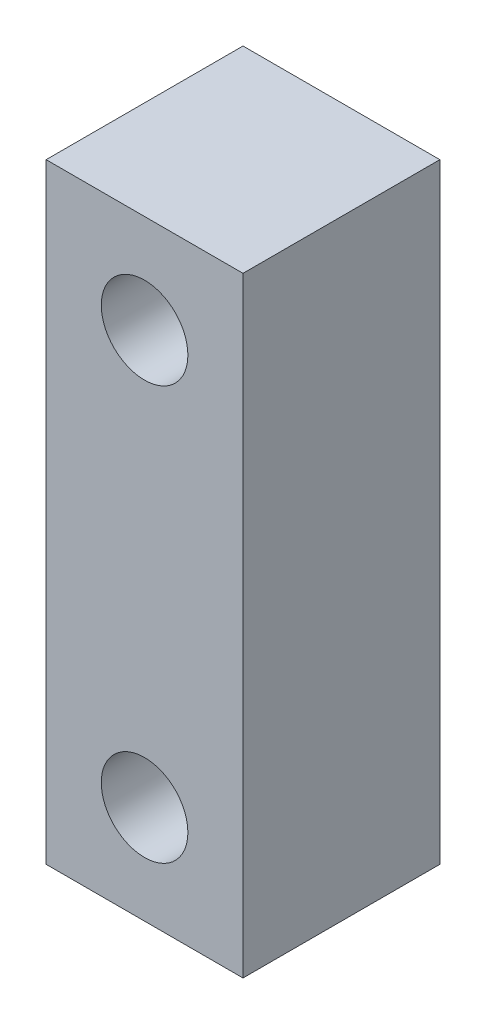
ISO-10303-21;
HEADER;
FILE_DESCRIPTION(('STEP AP214'),'2;1');
FILE_NAME('part.step','',(''),(''),'','','');
FILE_SCHEMA(('AUTOMOTIVE_DESIGN { 1 0 10303 214 1 1 1 1 }'));
ENDSEC;
DATA;
#1=APPLICATION_CONTEXT('core data for automotive mechanical design processes');
#2=APPLICATION_PROTOCOL_DEFINITION('international standard','automotive_design',2000,#1);
#3=PRODUCT_CONTEXT('',#1,'mechanical');
#4=PRODUCT('Part','Part','',(#3));
#5=PRODUCT_RELATED_PRODUCT_CATEGORY('part','',(#4));
#6=PRODUCT_DEFINITION_FORMATION('','',#4);
#7=PRODUCT_DEFINITION_CONTEXT('part definition',#1,'design');
#8=PRODUCT_DEFINITION('design','',#6,#7);
#9=PRODUCT_DEFINITION_SHAPE('','',#8);
#10=(LENGTH_UNIT() NAMED_UNIT(*) SI_UNIT(.MILLI.,.METRE.));
#11=(NAMED_UNIT(*) PLANE_ANGLE_UNIT() SI_UNIT($,.RADIAN.));
#12=(NAMED_UNIT(*) SI_UNIT($,.STERADIAN.) SOLID_ANGLE_UNIT());
#13=UNCERTAINTY_MEASURE_WITH_UNIT(LENGTH_MEASURE(1.E-05),#10,'distance_accuracy_value','');
#14=(GEOMETRIC_REPRESENTATION_CONTEXT(3) GLOBAL_UNCERTAINTY_ASSIGNED_CONTEXT((#13)) GLOBAL_UNIT_ASSIGNED_CONTEXT((#10,
#11,#12)) REPRESENTATION_CONTEXT('',''));
#15=CARTESIAN_POINT('',(0.,0.,0.));
#16=DIRECTION('',(0.,0.,1.));
#17=DIRECTION('',(1.,0.,0.));
#18=AXIS2_PLACEMENT_3D('',#15,#16,#17);
#19=CARTESIAN_POINT('',(-5.,-5.,-14.9999999999995));
#20=DIRECTION('',(-1.,0.,0.));
#21=DIRECTION('',(0.,-1.,0.));
#22=AXIS2_PLACEMENT_3D('',#19,#20,#21);
#23=PLANE('',#22);
#24=DIRECTION('',(0.,1.,0.));
#25=VECTOR('',#24,1.);
#26=CARTESIAN_POINT('',(-5.,-5.,-24.9999999999995));
#27=LINE('',#26,#25);
#28=CARTESIAN_POINT('',(-5.,-5.,-24.9999999999995));
#29=VERTEX_POINT('',#28);
#30=CARTESIAN_POINT('',(-5.,26.,-24.9999999999995));
#31=VERTEX_POINT('',#30);
#32=EDGE_CURVE('E95',#29,#31,#27,.T.);
#33=ORIENTED_EDGE('',*,*,#32,.F.);
#34=DIRECTION('',(0.,0.,-1.));
#35=VECTOR('',#34,1.);
#36=CARTESIAN_POINT('',(-5.,-5.,-14.9999999999995));
#37=LINE('',#36,#35);
#38=CARTESIAN_POINT('',(-5.,-5.,-14.9999999999995));
#39=VERTEX_POINT('',#38);
#40=EDGE_CURVE('E11',#39,#29,#37,.T.);
#41=ORIENTED_EDGE('',*,*,#40,.F.);
#42=DIRECTION('',(0.,1.,0.));
#43=VECTOR('',#42,1.);
#44=CARTESIAN_POINT('',(-5.,-5.,-14.9999999999995));
#45=LINE('',#44,#43);
#46=CARTESIAN_POINT('',(-5.,26.,-14.9999999999995));
#47=VERTEX_POINT('',#46);
#48=EDGE_CURVE('E88',#39,#47,#45,.T.);
#49=ORIENTED_EDGE('',*,*,#48,.T.);
#50=DIRECTION('',(0.,0.,-1.));
#51=VECTOR('',#50,1.);
#52=CARTESIAN_POINT('',(-5.,26.,-14.9999999999995));
#53=LINE('',#52,#51);
#54=EDGE_CURVE('E33',#47,#31,#53,.T.);
#55=ORIENTED_EDGE('',*,*,#54,.T.);
#56=EDGE_LOOP('',(#33,#41,#49,#55));
#57=FACE_BOUND('',#56,.T.);
#58=ADVANCED_FACE('F30',(#57),#23,.T.);
#59=CARTESIAN_POINT('',(5.,-5.,-14.9999999999995));
#60=DIRECTION('',(0.,-1.,0.));
#61=DIRECTION('',(0.,0.,-1.));
#62=AXIS2_PLACEMENT_3D('',#59,#60,#61);
#63=PLANE('',#62);
#64=DIRECTION('',(-1.,0.,0.));
#65=VECTOR('',#64,1.);
#66=CARTESIAN_POINT('',(5.,-5.,-24.9999999999995));
#67=LINE('',#66,#65);
#68=CARTESIAN_POINT('',(5.,-5.,-24.9999999999995));
#69=VERTEX_POINT('',#68);
#70=EDGE_CURVE('E90',#69,#29,#67,.T.);
#71=ORIENTED_EDGE('',*,*,#70,.F.);
#72=DIRECTION('',(0.,0.,-1.));
#73=VECTOR('',#72,1.);
#74=CARTESIAN_POINT('',(5.,-5.,-14.9999999999995));
#75=LINE('',#74,#73);
#76=CARTESIAN_POINT('',(5.,-5.,-14.9999999999995));
#77=VERTEX_POINT('',#76);
#78=EDGE_CURVE('E39',#77,#69,#75,.T.);
#79=ORIENTED_EDGE('',*,*,#78,.F.);
#80=DIRECTION('',(-1.,0.,0.));
#81=VECTOR('',#80,1.);
#82=CARTESIAN_POINT('',(5.,-5.,-14.9999999999995));
#83=LINE('',#82,#81);
#84=EDGE_CURVE('E85',#77,#39,#83,.T.);
#85=ORIENTED_EDGE('',*,*,#84,.T.);
#86=ORIENTED_EDGE('',*,*,#40,.T.);
#87=EDGE_LOOP('',(#71,#79,#85,#86));
#88=FACE_BOUND('',#87,.T.);
#89=ADVANCED_FACE('F106',(#88),#63,.T.);
#90=CARTESIAN_POINT('',(5.,26.,-14.9999999999995));
#91=DIRECTION('',(1.,0.,0.));
#92=DIRECTION('',(0.,1.,0.));
#93=AXIS2_PLACEMENT_3D('',#90,#91,#92);
#94=PLANE('',#93);
#95=DIRECTION('',(0.,-1.,0.));
#96=VECTOR('',#95,1.);
#97=CARTESIAN_POINT('',(5.,26.,-24.9999999999995));
#98=LINE('',#97,#96);
#99=CARTESIAN_POINT('',(5.,26.,-24.9999999999995));
#100=VERTEX_POINT('',#99);
#101=EDGE_CURVE('E80',#100,#69,#98,.T.);
#102=ORIENTED_EDGE('',*,*,#101,.F.);
#103=DIRECTION('',(0.,0.,-1.));
#104=VECTOR('',#103,1.);
#105=CARTESIAN_POINT('',(5.,26.,-14.9999999999995));
#106=LINE('',#105,#104);
#107=CARTESIAN_POINT('',(5.,26.,-14.9999999999995));
#108=VERTEX_POINT('',#107);
#109=EDGE_CURVE('E75',#108,#100,#106,.T.);
#110=ORIENTED_EDGE('',*,*,#109,.F.);
#111=DIRECTION('',(0.,-1.,0.));
#112=VECTOR('',#111,1.);
#113=CARTESIAN_POINT('',(5.,26.,-14.9999999999995));
#114=LINE('',#113,#112);
#115=EDGE_CURVE('E78',#108,#77,#114,.T.);
#116=ORIENTED_EDGE('',*,*,#115,.T.);
#117=ORIENTED_EDGE('',*,*,#78,.T.);
#118=EDGE_LOOP('',(#102,#110,#116,#117));
#119=FACE_BOUND('',#118,.T.);
#120=ADVANCED_FACE('F77',(#119),#94,.T.);
#121=CARTESIAN_POINT('',(-5.,26.,-14.9999999999995));
#122=DIRECTION('',(0.,1.,0.));
#123=DIRECTION('',(0.,0.,1.));
#124=AXIS2_PLACEMENT_3D('',#121,#122,#123);
#125=PLANE('',#124);
#126=DIRECTION('',(1.,0.,0.));
#127=VECTOR('',#126,1.);
#128=CARTESIAN_POINT('',(-5.,26.,-24.9999999999995));
#129=LINE('',#128,#127);
#130=EDGE_CURVE('E98',#31,#100,#129,.T.);
#131=ORIENTED_EDGE('',*,*,#130,.F.);
#132=ORIENTED_EDGE('',*,*,#54,.F.);
#133=DIRECTION('',(1.,0.,0.));
#134=VECTOR('',#133,1.);
#135=CARTESIAN_POINT('',(-5.,26.,-14.9999999999995));
#136=LINE('',#135,#134);
#137=EDGE_CURVE('E84',#47,#108,#136,.T.);
#138=ORIENTED_EDGE('',*,*,#137,.T.);
#139=ORIENTED_EDGE('',*,*,#109,.T.);
#140=EDGE_LOOP('',(#131,#132,#138,#139));
#141=FACE_BOUND('',#140,.T.);
#142=ADVANCED_FACE('F87',(#141),#125,.T.);
#143=CARTESIAN_POINT('',(-5.,26.,-14.9999999999995));
#144=DIRECTION('',(0.,0.,-1.));
#145=DIRECTION('',(-1.,0.,0.));
#146=AXIS2_PLACEMENT_3D('',#143,#144,#145);
#147=PLANE('',#146);
#148=CARTESIAN_POINT('',(0.,21.,-14.9999999999995));
#149=DIRECTION('',(0.,0.,-1.));
#150=DIRECTION('',(1.,0.,0.));
#151=AXIS2_PLACEMENT_3D('',#148,#149,#150);
#152=CIRCLE('',#151,2.2);
#153=CARTESIAN_POINT('',(2.2,21.,-14.9999999999995));
#154=VERTEX_POINT('',#153);
#155=EDGE_CURVE('E139',#154,#154,#152,.T.);
#156=ORIENTED_EDGE('',*,*,#155,.T.);
#157=EDGE_LOOP('',(#156));
#158=FACE_BOUND('',#157,.T.);
#159=CARTESIAN_POINT('',(0.,0.,-14.9999999999995));
#160=DIRECTION('',(0.,0.,-1.));
#161=DIRECTION('',(1.,0.,0.));
#162=AXIS2_PLACEMENT_3D('',#159,#160,#161);
#163=CIRCLE('',#162,2.2);
#164=CARTESIAN_POINT('',(2.2,0.,-14.9999999999995));
#165=VERTEX_POINT('',#164);
#166=EDGE_CURVE('E99',#165,#165,#163,.T.);
#167=ORIENTED_EDGE('',*,*,#166,.T.);
#168=EDGE_LOOP('',(#167));
#169=FACE_BOUND('',#168,.T.);
#170=ORIENTED_EDGE('',*,*,#48,.F.);
#171=ORIENTED_EDGE('',*,*,#84,.F.);
#172=ORIENTED_EDGE('',*,*,#115,.F.);
#173=ORIENTED_EDGE('',*,*,#137,.F.);
#174=EDGE_LOOP('',(#170,#171,#172,#173));
#175=FACE_BOUND('',#174,.T.);
#176=ADVANCED_FACE('F83',(#158,#169,#175),#147,.F.);
#177=CARTESIAN_POINT('',(-5.,26.,-24.9999999999995));
#178=DIRECTION('',(0.,0.,-1.));
#179=DIRECTION('',(-1.,0.,0.));
#180=AXIS2_PLACEMENT_3D('',#177,#178,#179);
#181=PLANE('',#180);
#182=CARTESIAN_POINT('',(0.,21.,-24.9999999999995));
#183=DIRECTION('',(0.,0.,-1.));
#184=DIRECTION('',(1.,0.,0.));
#185=AXIS2_PLACEMENT_3D('',#182,#183,#184);
#186=CIRCLE('',#185,2.2);
#187=CARTESIAN_POINT('',(2.2,21.,-24.9999999999995));
#188=VERTEX_POINT('',#187);
#189=EDGE_CURVE('E142',#188,#188,#186,.T.);
#190=ORIENTED_EDGE('',*,*,#189,.F.);
#191=EDGE_LOOP('',(#190));
#192=FACE_BOUND('',#191,.T.);
#193=CARTESIAN_POINT('',(0.,0.,-24.9999999999995));
#194=DIRECTION('',(0.,0.,-1.));
#195=DIRECTION('',(1.,0.,0.));
#196=AXIS2_PLACEMENT_3D('',#193,#194,#195);
#197=CIRCLE('',#196,2.2);
#198=CARTESIAN_POINT('',(2.2,0.,-24.9999999999995));
#199=VERTEX_POINT('',#198);
#200=EDGE_CURVE('E144',#199,#199,#197,.T.);
#201=ORIENTED_EDGE('',*,*,#200,.F.);
#202=EDGE_LOOP('',(#201));
#203=FACE_BOUND('',#202,.T.);
#204=ORIENTED_EDGE('',*,*,#32,.T.);
#205=ORIENTED_EDGE('',*,*,#130,.T.);
#206=ORIENTED_EDGE('',*,*,#101,.T.);
#207=ORIENTED_EDGE('',*,*,#70,.T.);
#208=EDGE_LOOP('',(#204,#205,#206,#207));
#209=FACE_BOUND('',#208,.T.);
#210=ADVANCED_FACE('F105',(#192,#203,#209),#181,.T.);
#211=CARTESIAN_POINT('',(0.,0.,-14.9999999999995));
#212=DIRECTION('',(0.,0.,-1.));
#213=DIRECTION('',(-1.,0.,0.));
#214=AXIS2_PLACEMENT_3D('',#211,#212,#213);
#215=CYLINDRICAL_SURFACE('',#214,2.2);
#216=ORIENTED_EDGE('',*,*,#166,.F.);
#217=EDGE_LOOP('',(#216));
#218=FACE_BOUND('',#217,.T.);
#219=ORIENTED_EDGE('',*,*,#200,.T.);
#220=EDGE_LOOP('',(#219));
#221=FACE_BOUND('',#220,.T.);
#222=ADVANCED_FACE('F124',(#218,#221),#215,.F.);
#223=CARTESIAN_POINT('',(0.,21.,-14.9999999999995));
#224=DIRECTION('',(0.,0.,-1.));
#225=DIRECTION('',(-1.,0.,0.));
#226=AXIS2_PLACEMENT_3D('',#223,#224,#225);
#227=CYLINDRICAL_SURFACE('',#226,2.2);
#228=ORIENTED_EDGE('',*,*,#155,.F.);
#229=EDGE_LOOP('',(#228));
#230=FACE_BOUND('',#229,.T.);
#231=ORIENTED_EDGE('',*,*,#189,.T.);
#232=EDGE_LOOP('',(#231));
#233=FACE_BOUND('',#232,.T.);
#234=ADVANCED_FACE('F131',(#230,#233),#227,.F.);
#235=CLOSED_SHELL('',(#58,#89,#120,#142,#176,#210,#222,#234));
#236=MANIFOLD_SOLID_BREP('B2',#235);
#237=ADVANCED_BREP_SHAPE_REPRESENTATION('',(#18,#236),#14);
#238=SHAPE_DEFINITION_REPRESENTATION(#9,#237);
ENDSEC;
END-ISO-10303-21;
